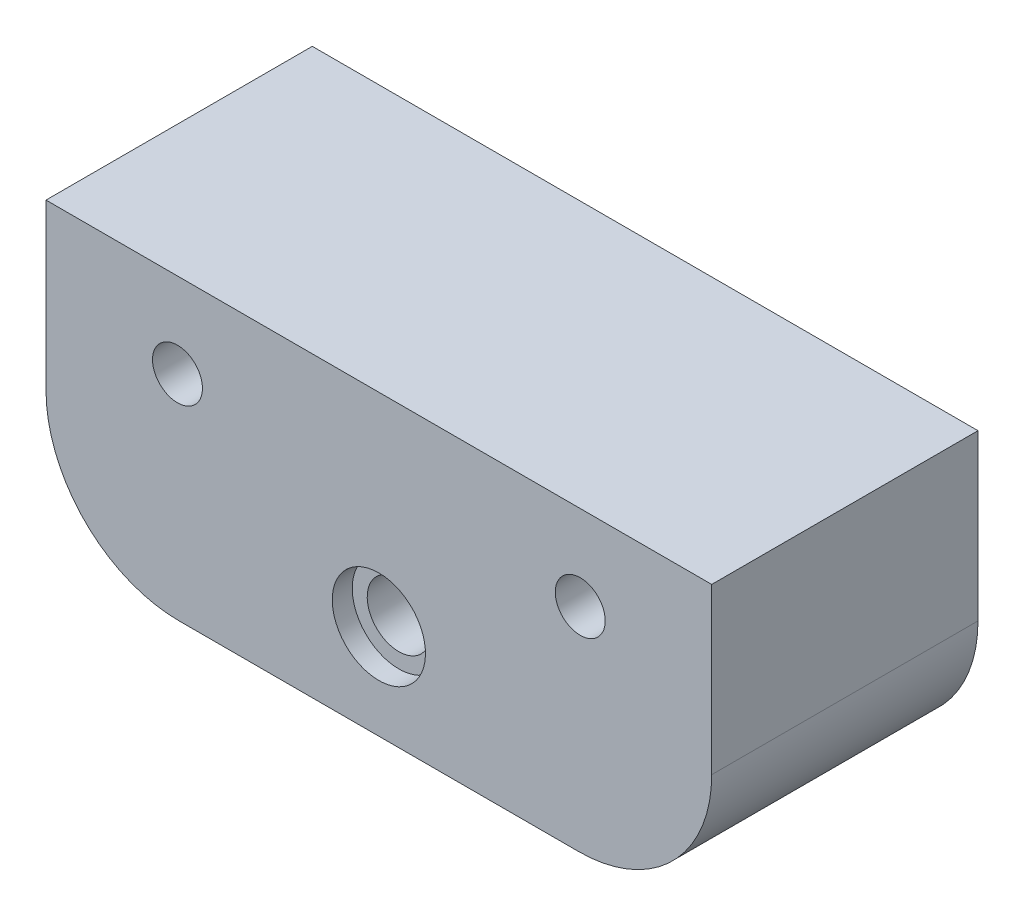
ISO-10303-21;
HEADER;
FILE_DESCRIPTION(('STEP AP214'),'2;1');
FILE_NAME('part.step','',(''),(''),'','','');
FILE_SCHEMA(('AUTOMOTIVE_DESIGN { 1 0 10303 214 1 1 1 1 }'));
ENDSEC;
DATA;
#1=APPLICATION_CONTEXT('core data for automotive mechanical design processes');
#2=APPLICATION_PROTOCOL_DEFINITION('international standard','automotive_design',2000,#1);
#3=PRODUCT_CONTEXT('',#1,'mechanical');
#4=PRODUCT('Part','Part','',(#3));
#5=PRODUCT_RELATED_PRODUCT_CATEGORY('part','',(#4));
#6=PRODUCT_DEFINITION_FORMATION('','',#4);
#7=PRODUCT_DEFINITION_CONTEXT('part definition',#1,'design');
#8=PRODUCT_DEFINITION('design','',#6,#7);
#9=PRODUCT_DEFINITION_SHAPE('','',#8);
#10=(LENGTH_UNIT() NAMED_UNIT(*) SI_UNIT(.MILLI.,.METRE.));
#11=(NAMED_UNIT(*) PLANE_ANGLE_UNIT() SI_UNIT($,.RADIAN.));
#12=(NAMED_UNIT(*) SI_UNIT($,.STERADIAN.) SOLID_ANGLE_UNIT());
#13=UNCERTAINTY_MEASURE_WITH_UNIT(LENGTH_MEASURE(1.E-05),#10,'distance_accuracy_value','');
#14=(GEOMETRIC_REPRESENTATION_CONTEXT(3) GLOBAL_UNCERTAINTY_ASSIGNED_CONTEXT((#13)) GLOBAL_UNIT_ASSIGNED_CONTEXT((#10,
#11,#12)) REPRESENTATION_CONTEXT('',''));
#15=CARTESIAN_POINT('',(0.,0.,0.));
#16=DIRECTION('',(0.,0.,1.));
#17=DIRECTION('',(1.,0.,0.));
#18=AXIS2_PLACEMENT_3D('',#15,#16,#17);
#19=CARTESIAN_POINT('',(-6.,-43.35,8.5));
#20=DIRECTION('',(0.,0.,-1.));
#21=DIRECTION('',(-1.,0.,0.));
#22=AXIS2_PLACEMENT_3D('',#19,#20,#21);
#23=CYLINDRICAL_SURFACE('',#22,4.);
#24=CARTESIAN_POINT('',(-6.,-43.35,12.5));
#25=DIRECTION('',(0.,0.,1.));
#26=DIRECTION('',(0.,-1.,0.));
#27=AXIS2_PLACEMENT_3D('',#24,#25,#26);
#28=CIRCLE('',#27,4.);
#29=CARTESIAN_POINT('',(-10.,-43.35,12.5));
#30=VERTEX_POINT('',#29);
#31=CARTESIAN_POINT('',(-6.,-47.35,12.5));
#32=VERTEX_POINT('',#31);
#33=EDGE_CURVE('E169',#30,#32,#28,.T.);
#34=ORIENTED_EDGE('',*,*,#33,.F.);
#35=DIRECTION('',(0.,0.,1.));
#36=VECTOR('',#35,1.);
#37=CARTESIAN_POINT('',(-10.,-43.35,8.5));
#38=LINE('',#37,#36);
#39=CARTESIAN_POINT('',(-10.,-43.35,4.5));
#40=VERTEX_POINT('',#39);
#41=EDGE_CURVE('E215',#40,#30,#38,.T.);
#42=ORIENTED_EDGE('',*,*,#41,.F.);
#43=CARTESIAN_POINT('',(-6.,-43.35,4.5));
#44=DIRECTION('',(0.,0.,-1.));
#45=DIRECTION('',(0.,1.,0.));
#46=AXIS2_PLACEMENT_3D('',#43,#44,#45);
#47=CIRCLE('',#46,4.);
#48=CARTESIAN_POINT('',(-6.,-47.35,4.5));
#49=VERTEX_POINT('',#48);
#50=EDGE_CURVE('E151',#49,#40,#47,.T.);
#51=ORIENTED_EDGE('',*,*,#50,.F.);
#52=DIRECTION('',(0.,0.,-1.));
#53=VECTOR('',#52,1.);
#54=CARTESIAN_POINT('',(-6.,-47.35,8.5));
#55=LINE('',#54,#53);
#56=EDGE_CURVE('E180',#32,#49,#55,.T.);
#57=ORIENTED_EDGE('',*,*,#56,.F.);
#58=EDGE_LOOP('',(#34,#42,#51,#57));
#59=FACE_BOUND('',#58,.T.);
#60=ADVANCED_FACE('F15',(#59),#23,.T.);
#61=CARTESIAN_POINT('',(6.,-43.35,8.5));
#62=DIRECTION('',(0.,0.,1.));
#63=DIRECTION('',(1.,0.,0.));
#64=AXIS2_PLACEMENT_3D('',#61,#62,#63);
#65=CYLINDRICAL_SURFACE('',#64,4.);
#66=CARTESIAN_POINT('',(6.,-43.35,12.5));
#67=DIRECTION('',(0.,0.,1.));
#68=DIRECTION('',(0.,-1.,0.));
#69=AXIS2_PLACEMENT_3D('',#66,#67,#68);
#70=CIRCLE('',#69,4.);
#71=CARTESIAN_POINT('',(6.,-47.35,12.5));
#72=VERTEX_POINT('',#71);
#73=CARTESIAN_POINT('',(10.,-43.35,12.5));
#74=VERTEX_POINT('',#73);
#75=EDGE_CURVE('E156',#72,#74,#70,.T.);
#76=ORIENTED_EDGE('',*,*,#75,.F.);
#77=DIRECTION('',(0.,0.,1.));
#78=VECTOR('',#77,1.);
#79=CARTESIAN_POINT('',(6.,-47.35,12.5));
#80=LINE('',#79,#78);
#81=CARTESIAN_POINT('',(6.,-47.35,4.5));
#82=VERTEX_POINT('',#81);
#83=EDGE_CURVE('E177',#82,#72,#80,.T.);
#84=ORIENTED_EDGE('',*,*,#83,.F.);
#85=CARTESIAN_POINT('',(6.,-43.35,4.5));
#86=DIRECTION('',(0.,0.,-1.));
#87=DIRECTION('',(0.,1.,0.));
#88=AXIS2_PLACEMENT_3D('',#85,#86,#87);
#89=CIRCLE('',#88,4.);
#90=CARTESIAN_POINT('',(10.,-43.35,4.5));
#91=VERTEX_POINT('',#90);
#92=EDGE_CURVE('E197',#91,#82,#89,.T.);
#93=ORIENTED_EDGE('',*,*,#92,.F.);
#94=DIRECTION('',(0.,0.,-1.));
#95=VECTOR('',#94,1.);
#96=CARTESIAN_POINT('',(10.,-43.35,4.5));
#97=LINE('',#96,#95);
#98=EDGE_CURVE('E212',#74,#91,#97,.T.);
#99=ORIENTED_EDGE('',*,*,#98,.F.);
#100=EDGE_LOOP('',(#76,#84,#93,#99));
#101=FACE_BOUND('',#100,.T.);
#102=ADVANCED_FACE('F337',(#101),#65,.T.);
#103=CARTESIAN_POINT('',(0.,-44.5,12.5));
#104=DIRECTION('',(0.,0.,-1.));
#105=DIRECTION('',(0.,1.,0.));
#106=AXIS2_PLACEMENT_3D('',#103,#104,#105);
#107=CYLINDRICAL_SURFACE('',#106,1.4);
#108=CARTESIAN_POINT('',(0.,-44.5,12.5));
#109=DIRECTION('',(0.,0.,-1.));
#110=DIRECTION('',(0.,1.,0.));
#111=AXIS2_PLACEMENT_3D('',#108,#109,#110);
#112=CIRCLE('',#111,1.4);
#113=CARTESIAN_POINT('',(0.,-43.1,12.5));
#114=VERTEX_POINT('',#113);
#115=EDGE_CURVE('E128',#114,#114,#112,.T.);
#116=ORIENTED_EDGE('',*,*,#115,.F.);
#117=EDGE_LOOP('',(#116));
#118=FACE_BOUND('',#117,.T.);
#119=CARTESIAN_POINT('',(0.,-44.5,11.9));
#120=DIRECTION('',(0.,0.,-1.));
#121=DIRECTION('',(0.,1.,0.));
#122=AXIS2_PLACEMENT_3D('',#119,#120,#121);
#123=CIRCLE('',#122,1.4);
#124=CARTESIAN_POINT('',(0.,-43.1,11.9));
#125=VERTEX_POINT('',#124);
#126=EDGE_CURVE('E9',#125,#125,#123,.T.);
#127=ORIENTED_EDGE('',*,*,#126,.T.);
#128=EDGE_LOOP('',(#127));
#129=FACE_BOUND('',#128,.T.);
#130=ADVANCED_FACE('F363',(#118,#129),#107,.F.);
#131=CARTESIAN_POINT('',(1.4,-44.5,11.9));
#132=DIRECTION('',(0.,0.,1.));
#133=DIRECTION('',(0.,-1.,0.));
#134=AXIS2_PLACEMENT_3D('',#131,#132,#133);
#135=PLANE('',#134);
#136=ORIENTED_EDGE('',*,*,#126,.F.);
#137=EDGE_LOOP('',(#136));
#138=FACE_BOUND('',#137,.T.);
#139=CARTESIAN_POINT('',(0.,-44.5,11.9));
#140=DIRECTION('',(0.,0.,-1.));
#141=DIRECTION('',(0.,1.,0.));
#142=AXIS2_PLACEMENT_3D('',#139,#140,#141);
#143=CIRCLE('',#142,0.95);
#144=CARTESIAN_POINT('',(0.,-43.55,11.9));
#145=VERTEX_POINT('',#144);
#146=EDGE_CURVE('E23',#145,#145,#143,.T.);
#147=ORIENTED_EDGE('',*,*,#146,.T.);
#148=EDGE_LOOP('',(#147));
#149=FACE_BOUND('',#148,.T.);
#150=ADVANCED_FACE('F368',(#138,#149),#135,.T.);
#151=CARTESIAN_POINT('',(0.,-44.5,12.5));
#152=DIRECTION('',(0.,0.,-1.));
#153=DIRECTION('',(0.,1.,0.));
#154=AXIS2_PLACEMENT_3D('',#151,#152,#153);
#155=CYLINDRICAL_SURFACE('',#154,0.95);
#156=ORIENTED_EDGE('',*,*,#146,.F.);
#157=EDGE_LOOP('',(#156));
#158=FACE_BOUND('',#157,.T.);
#159=CARTESIAN_POINT('',(0.,-44.5,4.5));
#160=DIRECTION('',(0.,0.,-1.));
#161=DIRECTION('',(0.,1.,0.));
#162=AXIS2_PLACEMENT_3D('',#159,#160,#161);
#163=CIRCLE('',#162,0.95);
#164=CARTESIAN_POINT('',(0.,-43.55,4.5));
#165=VERTEX_POINT('',#164);
#166=EDGE_CURVE('E184',#165,#165,#163,.T.);
#167=ORIENTED_EDGE('',*,*,#166,.T.);
#168=EDGE_LOOP('',(#167));
#169=FACE_BOUND('',#168,.T.);
#170=ADVANCED_FACE('F380',(#158,#169),#155,.F.);
#171=CARTESIAN_POINT('',(6.05,-40.95,4.5));
#172=DIRECTION('',(0.,0.,1.));
#173=DIRECTION('',(0.,-1.,0.));
#174=AXIS2_PLACEMENT_3D('',#171,#172,#173);
#175=CYLINDRICAL_SURFACE('',#174,1.1);
#176=CARTESIAN_POINT('',(6.05,-40.95,4.5));
#177=DIRECTION('',(0.,0.,1.));
#178=DIRECTION('',(0.,-1.,0.));
#179=AXIS2_PLACEMENT_3D('',#176,#177,#178);
#180=CIRCLE('',#179,1.1);
#181=CARTESIAN_POINT('',(6.05,-42.05,4.5));
#182=VERTEX_POINT('',#181);
#183=EDGE_CURVE('E187',#182,#182,#180,.T.);
#184=ORIENTED_EDGE('',*,*,#183,.F.);
#185=EDGE_LOOP('',(#184));
#186=FACE_BOUND('',#185,.T.);
#187=CARTESIAN_POINT('',(6.05,-40.95,5.1));
#188=DIRECTION('',(0.,0.,1.));
#189=DIRECTION('',(0.,-1.,0.));
#190=AXIS2_PLACEMENT_3D('',#187,#188,#189);
#191=CIRCLE('',#190,1.1);
#192=CARTESIAN_POINT('',(6.05,-42.05,5.1));
#193=VERTEX_POINT('',#192);
#194=EDGE_CURVE('E224',#193,#193,#191,.T.);
#195=ORIENTED_EDGE('',*,*,#194,.T.);
#196=EDGE_LOOP('',(#195));
#197=FACE_BOUND('',#196,.T.);
#198=ADVANCED_FACE('F474',(#186,#197),#175,.F.);
#199=CARTESIAN_POINT('',(7.15,-40.95,5.1));
#200=DIRECTION('',(0.,0.,-1.));
#201=DIRECTION('',(-1.,0.,0.));
#202=AXIS2_PLACEMENT_3D('',#199,#200,#201);
#203=PLANE('',#202);
#204=ORIENTED_EDGE('',*,*,#194,.F.);
#205=EDGE_LOOP('',(#204));
#206=FACE_BOUND('',#205,.T.);
#207=CARTESIAN_POINT('',(6.05,-40.95,5.1));
#208=DIRECTION('',(0.,0.,1.));
#209=DIRECTION('',(0.,-1.,0.));
#210=AXIS2_PLACEMENT_3D('',#207,#208,#209);
#211=CIRCLE('',#210,0.75);
#212=CARTESIAN_POINT('',(6.05,-41.7,5.1));
#213=VERTEX_POINT('',#212);
#214=EDGE_CURVE('E142',#213,#213,#211,.T.);
#215=ORIENTED_EDGE('',*,*,#214,.T.);
#216=EDGE_LOOP('',(#215));
#217=FACE_BOUND('',#216,.T.);
#218=ADVANCED_FACE('F376',(#206,#217),#203,.T.);
#219=CARTESIAN_POINT('',(6.05,-40.95,4.5));
#220=DIRECTION('',(0.,0.,1.));
#221=DIRECTION('',(0.,-1.,0.));
#222=AXIS2_PLACEMENT_3D('',#219,#220,#221);
#223=CYLINDRICAL_SURFACE('',#222,0.75);
#224=ORIENTED_EDGE('',*,*,#214,.F.);
#225=EDGE_LOOP('',(#224));
#226=FACE_BOUND('',#225,.T.);
#227=CARTESIAN_POINT('',(6.05,-40.95,12.5));
#228=DIRECTION('',(0.,0.,1.));
#229=DIRECTION('',(0.,-1.,0.));
#230=AXIS2_PLACEMENT_3D('',#227,#228,#229);
#231=CIRCLE('',#230,0.75);
#232=CARTESIAN_POINT('',(6.05,-41.7,12.5));
#233=VERTEX_POINT('',#232);
#234=EDGE_CURVE('E132',#233,#233,#231,.T.);
#235=ORIENTED_EDGE('',*,*,#234,.T.);
#236=EDGE_LOOP('',(#235));
#237=FACE_BOUND('',#236,.T.);
#238=ADVANCED_FACE('F372',(#226,#237),#223,.F.);
#239=CARTESIAN_POINT('',(-6.05,-40.95,4.5));
#240=DIRECTION('',(0.,0.,1.));
#241=DIRECTION('',(0.,-1.,0.));
#242=AXIS2_PLACEMENT_3D('',#239,#240,#241);
#243=CYLINDRICAL_SURFACE('',#242,1.1);
#244=CARTESIAN_POINT('',(-6.05,-40.95,4.5));
#245=DIRECTION('',(0.,0.,1.));
#246=DIRECTION('',(0.,-1.,0.));
#247=AXIS2_PLACEMENT_3D('',#244,#245,#246);
#248=CIRCLE('',#247,1.1);
#249=CARTESIAN_POINT('',(-6.05,-42.05,4.5));
#250=VERTEX_POINT('',#249);
#251=EDGE_CURVE('E190',#250,#250,#248,.T.);
#252=ORIENTED_EDGE('',*,*,#251,.F.);
#253=EDGE_LOOP('',(#252));
#254=FACE_BOUND('',#253,.T.);
#255=CARTESIAN_POINT('',(-6.05,-40.95,5.1));
#256=DIRECTION('',(0.,0.,1.));
#257=DIRECTION('',(0.,-1.,0.));
#258=AXIS2_PLACEMENT_3D('',#255,#256,#257);
#259=CIRCLE('',#258,1.1);
#260=CARTESIAN_POINT('',(-6.05,-42.05,5.1));
#261=VERTEX_POINT('',#260);
#262=EDGE_CURVE('E221',#261,#261,#259,.T.);
#263=ORIENTED_EDGE('',*,*,#262,.T.);
#264=EDGE_LOOP('',(#263));
#265=FACE_BOUND('',#264,.T.);
#266=ADVANCED_FACE('F375',(#254,#265),#243,.F.);
#267=CARTESIAN_POINT('',(-4.95,-40.95,5.1));
#268=DIRECTION('',(0.,0.,-1.));
#269=DIRECTION('',(-1.,0.,0.));
#270=AXIS2_PLACEMENT_3D('',#267,#268,#269);
#271=PLANE('',#270);
#272=ORIENTED_EDGE('',*,*,#262,.F.);
#273=EDGE_LOOP('',(#272));
#274=FACE_BOUND('',#273,.T.);
#275=CARTESIAN_POINT('',(-6.05,-40.95,5.1));
#276=DIRECTION('',(0.,0.,1.));
#277=DIRECTION('',(0.,-1.,0.));
#278=AXIS2_PLACEMENT_3D('',#275,#276,#277);
#279=CIRCLE('',#278,0.75);
#280=CARTESIAN_POINT('',(-6.05,-41.7,5.1));
#281=VERTEX_POINT('',#280);
#282=EDGE_CURVE('E218',#281,#281,#279,.T.);
#283=ORIENTED_EDGE('',*,*,#282,.T.);
#284=EDGE_LOOP('',(#283));
#285=FACE_BOUND('',#284,.T.);
#286=ADVANCED_FACE('F435',(#274,#285),#271,.T.);
#287=CARTESIAN_POINT('',(-6.05,-40.95,4.5));
#288=DIRECTION('',(0.,0.,1.));
#289=DIRECTION('',(0.,-1.,0.));
#290=AXIS2_PLACEMENT_3D('',#287,#288,#289);
#291=CYLINDRICAL_SURFACE('',#290,0.75);
#292=ORIENTED_EDGE('',*,*,#282,.F.);
#293=EDGE_LOOP('',(#292));
#294=FACE_BOUND('',#293,.T.);
#295=CARTESIAN_POINT('',(-6.05,-40.95,12.5));
#296=DIRECTION('',(0.,0.,1.));
#297=DIRECTION('',(0.,-1.,0.));
#298=AXIS2_PLACEMENT_3D('',#295,#296,#297);
#299=CIRCLE('',#298,0.75);
#300=CARTESIAN_POINT('',(-6.05,-41.7,12.5));
#301=VERTEX_POINT('',#300);
#302=EDGE_CURVE('E138',#301,#301,#299,.T.);
#303=ORIENTED_EDGE('',*,*,#302,.T.);
#304=EDGE_LOOP('',(#303));
#305=FACE_BOUND('',#304,.T.);
#306=ADVANCED_FACE('F425',(#294,#305),#291,.F.);
#307=CARTESIAN_POINT('',(-10.,-20.675,8.5));
#308=DIRECTION('',(1.,0.,0.));
#309=DIRECTION('',(0.,1.,0.));
#310=AXIS2_PLACEMENT_3D('',#307,#308,#309);
#311=PLANE('',#310);
#312=DIRECTION('',(0.,-1.,0.));
#313=VECTOR('',#312,1.);
#314=CARTESIAN_POINT('',(-10.,-42.875,4.5));
#315=LINE('',#314,#313);
#316=CARTESIAN_POINT('',(-10.,-38.4,4.5));
#317=VERTEX_POINT('',#316);
#318=EDGE_CURVE('E147',#317,#40,#315,.T.);
#319=ORIENTED_EDGE('',*,*,#318,.T.);
#320=ORIENTED_EDGE('',*,*,#41,.T.);
#321=DIRECTION('',(0.,1.,0.));
#322=VECTOR('',#321,1.);
#323=CARTESIAN_POINT('',(-10.,-42.875,12.5));
#324=LINE('',#323,#322);
#325=CARTESIAN_POINT('',(-10.,-38.4,12.5));
#326=VERTEX_POINT('',#325);
#327=EDGE_CURVE('E165',#30,#326,#324,.T.);
#328=ORIENTED_EDGE('',*,*,#327,.T.);
#329=DIRECTION('',(0.,0.,1.));
#330=VECTOR('',#329,1.);
#331=CARTESIAN_POINT('',(-10.,-38.4,8.5));
#332=LINE('',#331,#330);
#333=EDGE_CURVE('E206',#317,#326,#332,.T.);
#334=ORIENTED_EDGE('',*,*,#333,.F.);
#335=EDGE_LOOP('',(#319,#320,#328,#334));
#336=FACE_BOUND('',#335,.T.);
#337=ADVANCED_FACE('F343',(#336),#311,.F.);
#338=CARTESIAN_POINT('',(10.,-20.675,8.5));
#339=DIRECTION('',(1.,0.,0.));
#340=DIRECTION('',(0.,1.,0.));
#341=AXIS2_PLACEMENT_3D('',#338,#339,#340);
#342=PLANE('',#341);
#343=DIRECTION('',(0.,1.,0.));
#344=VECTOR('',#343,1.);
#345=CARTESIAN_POINT('',(10.,-42.875,12.5));
#346=LINE('',#345,#344);
#347=CARTESIAN_POINT('',(10.,-38.4,12.5));
#348=VERTEX_POINT('',#347);
#349=EDGE_CURVE('E160',#74,#348,#346,.T.);
#350=ORIENTED_EDGE('',*,*,#349,.F.);
#351=ORIENTED_EDGE('',*,*,#98,.T.);
#352=DIRECTION('',(0.,-1.,0.));
#353=VECTOR('',#352,1.);
#354=CARTESIAN_POINT('',(10.,-42.875,4.5));
#355=LINE('',#354,#353);
#356=CARTESIAN_POINT('',(10.,-38.4,4.5));
#357=VERTEX_POINT('',#356);
#358=EDGE_CURVE('E193',#357,#91,#355,.T.);
#359=ORIENTED_EDGE('',*,*,#358,.F.);
#360=DIRECTION('',(0.,0.,1.));
#361=VECTOR('',#360,1.);
#362=CARTESIAN_POINT('',(10.,-38.4,8.5));
#363=LINE('',#362,#361);
#364=EDGE_CURVE('E209',#357,#348,#363,.T.);
#365=ORIENTED_EDGE('',*,*,#364,.T.);
#366=EDGE_LOOP('',(#350,#351,#359,#365));
#367=FACE_BOUND('',#366,.T.);
#368=ADVANCED_FACE('F346',(#367),#342,.T.);
#369=CARTESIAN_POINT('',(10.,-38.4,8.5));
#370=DIRECTION('',(0.,-1.,0.));
#371=DIRECTION('',(0.,0.,-1.));
#372=AXIS2_PLACEMENT_3D('',#369,#370,#371);
#373=PLANE('',#372);
#374=ORIENTED_EDGE('',*,*,#333,.T.);
#375=DIRECTION('',(-1.,0.,0.));
#376=VECTOR('',#375,1.);
#377=CARTESIAN_POINT('',(10.,-38.4,12.5));
#378=LINE('',#377,#376);
#379=EDGE_CURVE('E164',#348,#326,#378,.T.);
#380=ORIENTED_EDGE('',*,*,#379,.F.);
#381=ORIENTED_EDGE('',*,*,#364,.F.);
#382=DIRECTION('',(-1.,0.,0.));
#383=VECTOR('',#382,1.);
#384=CARTESIAN_POINT('',(10.,-38.4,4.5));
#385=LINE('',#384,#383);
#386=EDGE_CURVE('E150',#357,#317,#385,.T.);
#387=ORIENTED_EDGE('',*,*,#386,.T.);
#388=EDGE_LOOP('',(#374,#380,#381,#387));
#389=FACE_BOUND('',#388,.T.);
#390=ADVANCED_FACE('F348',(#389),#373,.F.);
#391=CARTESIAN_POINT('',(10.,-42.875,4.5));
#392=DIRECTION('',(0.,0.,-1.));
#393=DIRECTION('',(-1.,0.,0.));
#394=AXIS2_PLACEMENT_3D('',#391,#392,#393);
#395=PLANE('',#394);
#396=ORIENTED_EDGE('',*,*,#358,.T.);
#397=ORIENTED_EDGE('',*,*,#92,.T.);
#398=DIRECTION('',(-1.,0.,0.));
#399=VECTOR('',#398,1.);
#400=CARTESIAN_POINT('',(10.,-47.35,4.5));
#401=LINE('',#400,#399);
#402=EDGE_CURVE('E176',#82,#49,#401,.T.);
#403=ORIENTED_EDGE('',*,*,#402,.T.);
#404=ORIENTED_EDGE('',*,*,#50,.T.);
#405=ORIENTED_EDGE('',*,*,#318,.F.);
#406=ORIENTED_EDGE('',*,*,#386,.F.);
#407=EDGE_LOOP('',(#396,#397,#403,#404,#405,#406));
#408=FACE_BOUND('',#407,.T.);
#409=ORIENTED_EDGE('',*,*,#251,.T.);
#410=EDGE_LOOP('',(#409));
#411=FACE_BOUND('',#410,.T.);
#412=ORIENTED_EDGE('',*,*,#183,.T.);
#413=EDGE_LOOP('',(#412));
#414=FACE_BOUND('',#413,.T.);
#415=ORIENTED_EDGE('',*,*,#166,.F.);
#416=EDGE_LOOP('',(#415));
#417=FACE_BOUND('',#416,.T.);
#418=ADVANCED_FACE('F328',(#408,#411,#414,#417),#395,.T.);
#419=CARTESIAN_POINT('',(10.,-47.35,8.5));
#420=DIRECTION('',(0.,1.,0.));
#421=DIRECTION('',(1.,0.,0.));
#422=AXIS2_PLACEMENT_3D('',#419,#420,#421);
#423=PLANE('',#422);
#424=ORIENTED_EDGE('',*,*,#402,.F.);
#425=ORIENTED_EDGE('',*,*,#83,.T.);
#426=DIRECTION('',(-1.,0.,0.));
#427=VECTOR('',#426,1.);
#428=CARTESIAN_POINT('',(10.,-47.35,12.5));
#429=LINE('',#428,#427);
#430=EDGE_CURVE('E146',#72,#32,#429,.T.);
#431=ORIENTED_EDGE('',*,*,#430,.T.);
#432=ORIENTED_EDGE('',*,*,#56,.T.);
#433=EDGE_LOOP('',(#424,#425,#431,#432));
#434=FACE_BOUND('',#433,.T.);
#435=ADVANCED_FACE('F323',(#434),#423,.F.);
#436=CARTESIAN_POINT('',(10.,-42.875,12.5));
#437=DIRECTION('',(0.,0.,1.));
#438=DIRECTION('',(0.,-1.,0.));
#439=AXIS2_PLACEMENT_3D('',#436,#437,#438);
#440=PLANE('',#439);
#441=ORIENTED_EDGE('',*,*,#430,.F.);
#442=ORIENTED_EDGE('',*,*,#75,.T.);
#443=ORIENTED_EDGE('',*,*,#349,.T.);
#444=ORIENTED_EDGE('',*,*,#379,.T.);
#445=ORIENTED_EDGE('',*,*,#327,.F.);
#446=ORIENTED_EDGE('',*,*,#33,.T.);
#447=EDGE_LOOP('',(#441,#442,#443,#444,#445,#446));
#448=FACE_BOUND('',#447,.T.);
#449=ORIENTED_EDGE('',*,*,#302,.F.);
#450=EDGE_LOOP('',(#449));
#451=FACE_BOUND('',#450,.T.);
#452=ORIENTED_EDGE('',*,*,#234,.F.);
#453=EDGE_LOOP('',(#452));
#454=FACE_BOUND('',#453,.T.);
#455=ORIENTED_EDGE('',*,*,#115,.T.);
#456=EDGE_LOOP('',(#455));
#457=FACE_BOUND('',#456,.T.);
#458=ADVANCED_FACE('F129',(#448,#451,#454,#457),#440,.T.);
#459=CLOSED_SHELL('',(#60,#102,#130,#150,#170,#198,#218,#238,#266,#286,#306,#337,#368,#390,#418,
#435,#458));
#460=MANIFOLD_SOLID_BREP('B1',#459);
#461=ADVANCED_BREP_SHAPE_REPRESENTATION('',(#18,#460),#14);
#462=SHAPE_DEFINITION_REPRESENTATION(#9,#461);
ENDSEC;
END-ISO-10303-21;
